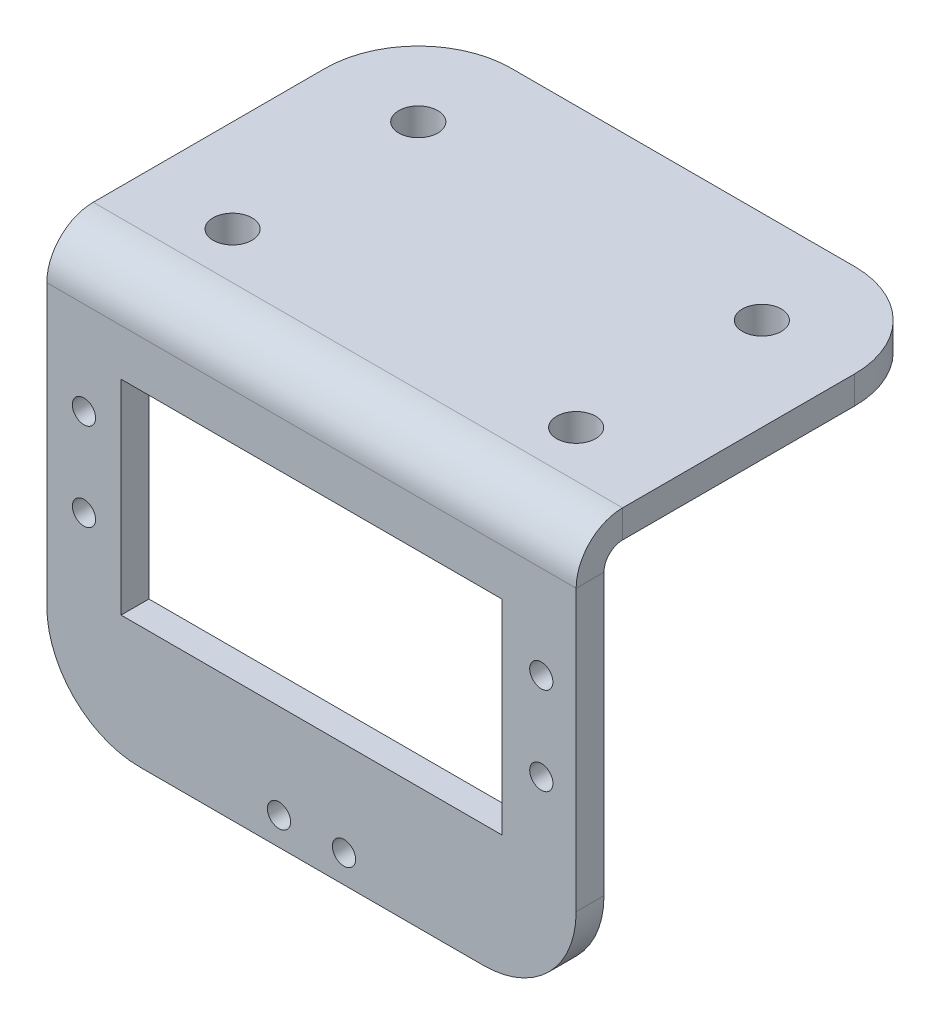
ISO-10303-21;
HEADER;
FILE_DESCRIPTION(('STEP AP214'),'2;1');
FILE_NAME('part.step','',(''),(''),'','','');
FILE_SCHEMA(('AUTOMOTIVE_DESIGN { 1 0 10303 214 1 1 1 1 }'));
ENDSEC;
DATA;
#1=APPLICATION_CONTEXT('core data for automotive mechanical design processes');
#2=APPLICATION_PROTOCOL_DEFINITION('international standard','automotive_design',2000,#1);
#3=PRODUCT_CONTEXT('',#1,'mechanical');
#4=PRODUCT('Part','Part','',(#3));
#5=PRODUCT_RELATED_PRODUCT_CATEGORY('part','',(#4));
#6=PRODUCT_DEFINITION_FORMATION('','',#4);
#7=PRODUCT_DEFINITION_CONTEXT('part definition',#1,'design');
#8=PRODUCT_DEFINITION('design','',#6,#7);
#9=PRODUCT_DEFINITION_SHAPE('','',#8);
#10=(LENGTH_UNIT() NAMED_UNIT(*) SI_UNIT(.MILLI.,.METRE.));
#11=(NAMED_UNIT(*) PLANE_ANGLE_UNIT() SI_UNIT($,.RADIAN.));
#12=(NAMED_UNIT(*) SI_UNIT($,.STERADIAN.) SOLID_ANGLE_UNIT());
#13=UNCERTAINTY_MEASURE_WITH_UNIT(LENGTH_MEASURE(1.E-05),#10,'distance_accuracy_value','');
#14=(GEOMETRIC_REPRESENTATION_CONTEXT(3) GLOBAL_UNCERTAINTY_ASSIGNED_CONTEXT((#13)) GLOBAL_UNIT_ASSIGNED_CONTEXT((#10,
#11,#12)) REPRESENTATION_CONTEXT('',''));
#15=CARTESIAN_POINT('',(0.,0.,0.));
#16=DIRECTION('',(0.,0.,1.));
#17=DIRECTION('',(1.,0.,0.));
#18=AXIS2_PLACEMENT_3D('',#15,#16,#17);
#19=CARTESIAN_POINT('',(57.,-1.58206781009085E-13,3.));
#20=DIRECTION('',(-1.,0.,0.));
#21=DIRECTION('',(0.,-1.,0.));
#22=AXIS2_PLACEMENT_3D('',#19,#20,#21);
#23=PLANE('',#22);
#24=DIRECTION('',(0.,-1.,0.));
#25=VECTOR('',#24,1.);
#26=CARTESIAN_POINT('',(57.,-1.58206781009085E-13,3.));
#27=LINE('',#26,#25);
#28=CARTESIAN_POINT('',(57.,5.00000000000001,3.));
#29=VERTEX_POINT('',#28);
#30=CARTESIAN_POINT('',(56.9999999999999,-25.1645936480419,3.));
#31=VERTEX_POINT('',#30);
#32=EDGE_CURVE('E412',#29,#31,#27,.T.);
#33=ORIENTED_EDGE('',*,*,#32,.T.);
#34=DIRECTION('',(0.,0.,1.));
#35=VECTOR('',#34,1.);
#36=CARTESIAN_POINT('',(56.9999999999999,-25.1645936480419,3.));
#37=LINE('',#36,#35);
#38=CARTESIAN_POINT('',(57.,-25.1645936480419,0.));
#39=VERTEX_POINT('',#38);
#40=EDGE_CURVE('E501',#31,#39,#37,.F.);
#41=ORIENTED_EDGE('',*,*,#40,.T.);
#42=DIRECTION('',(0.,1.,0.));
#43=VECTOR('',#42,1.);
#44=CARTESIAN_POINT('',(57.,0.,0.));
#45=LINE('',#44,#43);
#46=CARTESIAN_POINT('',(57.,5.00000000000001,0.));
#47=VERTEX_POINT('',#46);
#48=EDGE_CURVE('E451',#47,#39,#45,.F.);
#49=ORIENTED_EDGE('',*,*,#48,.F.);
#50=DIRECTION('',(0.,0.,1.));
#51=VECTOR('',#50,1.);
#52=CARTESIAN_POINT('',(57.,5.00000000000001,0.));
#53=LINE('',#52,#51);
#54=EDGE_CURVE('E396',#47,#29,#53,.T.);
#55=ORIENTED_EDGE('',*,*,#54,.T.);
#56=EDGE_LOOP('',(#33,#41,#49,#55));
#57=FACE_BOUND('',#56,.T.);
#58=ADVANCED_FACE('F237',(#57),#23,.F.);
#59=CARTESIAN_POINT('',(0.,0.,3.));
#60=DIRECTION('',(0.,0.,1.));
#61=DIRECTION('',(1.,0.,0.));
#62=AXIS2_PLACEMENT_3D('',#59,#60,#61);
#63=PLANE('',#62);
#64=DIRECTION('',(1.,0.,0.));
#65=VECTOR('',#64,1.);
#66=CARTESIAN_POINT('',(0.,0.,3.));
#67=LINE('',#66,#65);
#68=CARTESIAN_POINT('',(8.,0.,3.));
#69=VERTEX_POINT('',#68);
#70=CARTESIAN_POINT('',(49.,0.,3.));
#71=VERTEX_POINT('',#70);
#72=EDGE_CURVE('E418',#69,#71,#67,.T.);
#73=ORIENTED_EDGE('',*,*,#72,.T.);
#74=DIRECTION('',(0.,1.,0.));
#75=VECTOR('',#74,1.);
#76=CARTESIAN_POINT('',(49.0000000000002,-22.0000000000049,3.));
#77=LINE('',#76,#75);
#78=CARTESIAN_POINT('',(49.0000000000002,-22.0000000000049,3.));
#79=VERTEX_POINT('',#78);
#80=EDGE_CURVE('E421',#79,#71,#77,.T.);
#81=ORIENTED_EDGE('',*,*,#80,.F.);
#82=DIRECTION('',(1.,0.,0.));
#83=VECTOR('',#82,1.);
#84=CARTESIAN_POINT('',(8.00000000000015,-22.0000000000052,3.));
#85=LINE('',#84,#83);
#86=CARTESIAN_POINT('',(8.00000000000015,-22.0000000000052,3.));
#87=VERTEX_POINT('',#86);
#88=EDGE_CURVE('E424',#87,#79,#85,.T.);
#89=ORIENTED_EDGE('',*,*,#88,.F.);
#90=DIRECTION('',(0.,-1.,0.));
#91=VECTOR('',#90,1.);
#92=CARTESIAN_POINT('',(8.,0.,3.));
#93=LINE('',#92,#91);
#94=EDGE_CURVE('E427',#69,#87,#93,.T.);
#95=ORIENTED_EDGE('',*,*,#94,.F.);
#96=EDGE_LOOP('',(#73,#81,#89,#95));
#97=FACE_BOUND('',#96,.T.);
#98=CARTESIAN_POINT('',(32.,-32.1645936480419,3.));
#99=DIRECTION('',(0.,0.,1.));
#100=DIRECTION('',(1.,0.,0.));
#101=AXIS2_PLACEMENT_3D('',#98,#99,#100);
#102=CIRCLE('',#101,1.25);
#103=CARTESIAN_POINT('',(33.25,-32.1645936480419,3.));
#104=VERTEX_POINT('',#103);
#105=EDGE_CURVE('E430',#104,#104,#102,.T.);
#106=ORIENTED_EDGE('',*,*,#105,.F.);
#107=EDGE_LOOP('',(#106));
#108=FACE_BOUND('',#107,.T.);
#109=CARTESIAN_POINT('',(53.2500000000001,-14.4545936480419,3.));
#110=DIRECTION('',(0.,0.,1.));
#111=DIRECTION('',(1.,0.,0.));
#112=AXIS2_PLACEMENT_3D('',#109,#110,#111);
#113=CIRCLE('',#112,1.25000000000001);
#114=CARTESIAN_POINT('',(54.5000000000001,-14.4545936480419,3.));
#115=VERTEX_POINT('',#114);
#116=EDGE_CURVE('E433',#115,#115,#113,.T.);
#117=ORIENTED_EDGE('',*,*,#116,.F.);
#118=EDGE_LOOP('',(#117));
#119=FACE_BOUND('',#118,.T.);
#120=CARTESIAN_POINT('',(4.00000000000004,-4.99999999999997,3.));
#121=DIRECTION('',(0.,0.,1.));
#122=DIRECTION('',(1.,0.,0.));
#123=AXIS2_PLACEMENT_3D('',#120,#121,#122);
#124=CIRCLE('',#123,1.25000000000004);
#125=CARTESIAN_POINT('',(5.25000000000008,-4.99999999999997,3.));
#126=VERTEX_POINT('',#125);
#127=EDGE_CURVE('E436',#126,#126,#124,.T.);
#128=ORIENTED_EDGE('',*,*,#127,.F.);
#129=EDGE_LOOP('',(#128));
#130=FACE_BOUND('',#129,.T.);
#131=CARTESIAN_POINT('',(4.0000000000001,-14.4545936480419,3.));
#132=DIRECTION('',(0.,0.,1.));
#133=DIRECTION('',(1.,0.,0.));
#134=AXIS2_PLACEMENT_3D('',#131,#132,#133);
#135=CIRCLE('',#134,1.25);
#136=CARTESIAN_POINT('',(5.2500000000001,-14.4545936480419,3.));
#137=VERTEX_POINT('',#136);
#138=EDGE_CURVE('E439',#137,#137,#135,.T.);
#139=ORIENTED_EDGE('',*,*,#138,.F.);
#140=EDGE_LOOP('',(#139));
#141=FACE_BOUND('',#140,.T.);
#142=CARTESIAN_POINT('',(25.,-32.1645936480419,3.));
#143=DIRECTION('',(0.,0.,1.));
#144=DIRECTION('',(1.,0.,0.));
#145=AXIS2_PLACEMENT_3D('',#142,#143,#144);
#146=CIRCLE('',#145,1.24999999999924);
#147=CARTESIAN_POINT('',(26.2499999999992,-32.1645936480419,3.));
#148=VERTEX_POINT('',#147);
#149=EDGE_CURVE('E442',#148,#148,#146,.T.);
#150=ORIENTED_EDGE('',*,*,#149,.F.);
#151=EDGE_LOOP('',(#150));
#152=FACE_BOUND('',#151,.T.);
#153=CARTESIAN_POINT('',(53.25,-4.99999999999963,3.));
#154=DIRECTION('',(0.,0.,1.));
#155=DIRECTION('',(1.,0.,0.));
#156=AXIS2_PLACEMENT_3D('',#153,#154,#155);
#157=CIRCLE('',#156,1.25);
#158=CARTESIAN_POINT('',(54.5,-4.99999999999963,3.));
#159=VERTEX_POINT('',#158);
#160=EDGE_CURVE('E445',#159,#159,#157,.T.);
#161=ORIENTED_EDGE('',*,*,#160,.F.);
#162=EDGE_LOOP('',(#161));
#163=FACE_BOUND('',#162,.T.);
#164=DIRECTION('',(1.,0.,0.));
#165=VECTOR('',#164,1.);
#166=CARTESIAN_POINT('',(8.,-35.1645936480419,3.));
#167=LINE('',#166,#165);
#168=CARTESIAN_POINT('',(10.,-35.1645936480419,3.));
#169=VERTEX_POINT('',#168);
#170=CARTESIAN_POINT('',(46.9999999999999,-35.1645936480419,3.));
#171=VERTEX_POINT('',#170);
#172=EDGE_CURVE('E409',#169,#171,#167,.T.);
#173=ORIENTED_EDGE('',*,*,#172,.T.);
#174=CARTESIAN_POINT('',(46.9999999999999,-25.1645936480419,3.));
#175=DIRECTION('',(0.,0.,1.));
#176=DIRECTION('',(1.,0.,0.));
#177=AXIS2_PLACEMENT_3D('',#174,#175,#176);
#178=CIRCLE('',#177,10.);
#179=EDGE_CURVE('E499',#171,#31,#178,.T.);
#180=ORIENTED_EDGE('',*,*,#179,.T.);
#181=ORIENTED_EDGE('',*,*,#32,.F.);
#182=DIRECTION('',(1.,0.,0.));
#183=VECTOR('',#182,1.);
#184=CARTESIAN_POINT('',(57.,5.00000000000001,3.));
#185=LINE('',#184,#183);
#186=CARTESIAN_POINT('',(0.,5.00000000000001,3.));
#187=VERTEX_POINT('',#186);
#188=EDGE_CURVE('E369',#29,#187,#185,.F.);
#189=ORIENTED_EDGE('',*,*,#188,.T.);
#190=DIRECTION('',(0.,1.,0.));
#191=VECTOR('',#190,1.);
#192=CARTESIAN_POINT('',(0.,0.,3.));
#193=LINE('',#192,#191);
#194=CARTESIAN_POINT('',(0.,-25.1645936480419,3.));
#195=VERTEX_POINT('',#194);
#196=EDGE_CURVE('E416',#195,#187,#193,.T.);
#197=ORIENTED_EDGE('',*,*,#196,.F.);
#198=CARTESIAN_POINT('',(10.,-25.1645936480419,3.));
#199=DIRECTION('',(0.,0.,1.));
#200=DIRECTION('',(1.,0.,0.));
#201=AXIS2_PLACEMENT_3D('',#198,#199,#200);
#202=CIRCLE('',#201,10.);
#203=EDGE_CURVE('E497',#195,#169,#202,.T.);
#204=ORIENTED_EDGE('',*,*,#203,.T.);
#205=EDGE_LOOP('',(#173,#180,#181,#189,#197,#204));
#206=FACE_BOUND('',#205,.T.);
#207=ADVANCED_FACE('F584',(#97,#108,#119,#130,#141,#152,#163,#206),#63,.T.);
#208=CARTESIAN_POINT('',(0.,0.,0.));
#209=DIRECTION('',(0.,0.,1.));
#210=DIRECTION('',(1.,0.,0.));
#211=AXIS2_PLACEMENT_3D('',#208,#209,#210);
#212=PLANE('',#211);
#213=CARTESIAN_POINT('',(53.25,-4.99999999999963,0.));
#214=DIRECTION('',(0.,0.,1.));
#215=DIRECTION('',(1.,0.,0.));
#216=AXIS2_PLACEMENT_3D('',#213,#214,#215);
#217=CIRCLE('',#216,1.25);
#218=CARTESIAN_POINT('',(54.5,-4.99999999999963,0.));
#219=VERTEX_POINT('',#218);
#220=EDGE_CURVE('E413',#219,#219,#217,.T.);
#221=ORIENTED_EDGE('',*,*,#220,.T.);
#222=EDGE_LOOP('',(#221));
#223=FACE_BOUND('',#222,.T.);
#224=CARTESIAN_POINT('',(25.,-32.1645936480419,0.));
#225=DIRECTION('',(0.,0.,1.));
#226=DIRECTION('',(1.,0.,0.));
#227=AXIS2_PLACEMENT_3D('',#224,#225,#226);
#228=CIRCLE('',#227,1.24999999999924);
#229=CARTESIAN_POINT('',(26.2499999999992,-32.1645936480419,0.));
#230=VERTEX_POINT('',#229);
#231=EDGE_CURVE('E480',#230,#230,#228,.T.);
#232=ORIENTED_EDGE('',*,*,#231,.T.);
#233=EDGE_LOOP('',(#232));
#234=FACE_BOUND('',#233,.T.);
#235=CARTESIAN_POINT('',(4.0000000000001,-14.4545936480419,0.));
#236=DIRECTION('',(0.,0.,1.));
#237=DIRECTION('',(1.,0.,0.));
#238=AXIS2_PLACEMENT_3D('',#235,#236,#237);
#239=CIRCLE('',#238,1.25);
#240=CARTESIAN_POINT('',(5.2500000000001,-14.4545936480419,0.));
#241=VERTEX_POINT('',#240);
#242=EDGE_CURVE('E477',#241,#241,#239,.T.);
#243=ORIENTED_EDGE('',*,*,#242,.T.);
#244=EDGE_LOOP('',(#243));
#245=FACE_BOUND('',#244,.T.);
#246=CARTESIAN_POINT('',(4.00000000000004,-4.99999999999997,0.));
#247=DIRECTION('',(0.,0.,1.));
#248=DIRECTION('',(1.,0.,0.));
#249=AXIS2_PLACEMENT_3D('',#246,#247,#248);
#250=CIRCLE('',#249,1.25000000000004);
#251=CARTESIAN_POINT('',(5.25000000000008,-4.99999999999997,0.));
#252=VERTEX_POINT('',#251);
#253=EDGE_CURVE('E474',#252,#252,#250,.T.);
#254=ORIENTED_EDGE('',*,*,#253,.T.);
#255=EDGE_LOOP('',(#254));
#256=FACE_BOUND('',#255,.T.);
#257=CARTESIAN_POINT('',(53.2500000000001,-14.4545936480419,0.));
#258=DIRECTION('',(0.,0.,1.));
#259=DIRECTION('',(1.,0.,0.));
#260=AXIS2_PLACEMENT_3D('',#257,#258,#259);
#261=CIRCLE('',#260,1.25000000000001);
#262=CARTESIAN_POINT('',(54.5000000000001,-14.4545936480419,0.));
#263=VERTEX_POINT('',#262);
#264=EDGE_CURVE('E471',#263,#263,#261,.T.);
#265=ORIENTED_EDGE('',*,*,#264,.T.);
#266=EDGE_LOOP('',(#265));
#267=FACE_BOUND('',#266,.T.);
#268=CARTESIAN_POINT('',(32.,-32.1645936480419,0.));
#269=DIRECTION('',(0.,0.,1.));
#270=DIRECTION('',(1.,0.,0.));
#271=AXIS2_PLACEMENT_3D('',#268,#269,#270);
#272=CIRCLE('',#271,1.25);
#273=CARTESIAN_POINT('',(33.25,-32.1645936480419,0.));
#274=VERTEX_POINT('',#273);
#275=EDGE_CURVE('E463',#274,#274,#272,.T.);
#276=ORIENTED_EDGE('',*,*,#275,.T.);
#277=EDGE_LOOP('',(#276));
#278=FACE_BOUND('',#277,.T.);
#279=DIRECTION('',(1.,0.,0.));
#280=VECTOR('',#279,1.);
#281=CARTESIAN_POINT('',(0.,0.,0.));
#282=LINE('',#281,#280);
#283=CARTESIAN_POINT('',(8.,0.,0.));
#284=VERTEX_POINT('',#283);
#285=CARTESIAN_POINT('',(49.,0.,0.));
#286=VERTEX_POINT('',#285);
#287=EDGE_CURVE('E454',#284,#286,#282,.T.);
#288=ORIENTED_EDGE('',*,*,#287,.F.);
#289=DIRECTION('',(0.,1.,0.));
#290=VECTOR('',#289,1.);
#291=CARTESIAN_POINT('',(8.,0.,0.));
#292=LINE('',#291,#290);
#293=CARTESIAN_POINT('',(8.00000000000015,-22.0000000000052,0.));
#294=VERTEX_POINT('',#293);
#295=EDGE_CURVE('E460',#284,#294,#292,.F.);
#296=ORIENTED_EDGE('',*,*,#295,.T.);
#297=DIRECTION('',(1.,0.,0.));
#298=VECTOR('',#297,1.);
#299=CARTESIAN_POINT('',(0.,-22.0000000000052,0.));
#300=LINE('',#299,#298);
#301=CARTESIAN_POINT('',(49.0000000000002,-22.0000000000049,0.));
#302=VERTEX_POINT('',#301);
#303=EDGE_CURVE('E464',#294,#302,#300,.T.);
#304=ORIENTED_EDGE('',*,*,#303,.T.);
#305=DIRECTION('',(0.,1.,0.));
#306=VECTOR('',#305,1.);
#307=CARTESIAN_POINT('',(49.0000000000002,0.,0.));
#308=LINE('',#307,#306);
#309=EDGE_CURVE('E459',#302,#286,#308,.T.);
#310=ORIENTED_EDGE('',*,*,#309,.T.);
#311=EDGE_LOOP('',(#288,#296,#304,#310));
#312=FACE_BOUND('',#311,.T.);
#313=ORIENTED_EDGE('',*,*,#48,.T.);
#314=CARTESIAN_POINT('',(46.9999999999999,-25.1645936480419,0.));
#315=DIRECTION('',(0.,0.,1.));
#316=DIRECTION('',(1.,0.,0.));
#317=AXIS2_PLACEMENT_3D('',#314,#315,#316);
#318=CIRCLE('',#317,10.);
#319=CARTESIAN_POINT('',(46.9999999999999,-35.1645936480419,0.));
#320=VERTEX_POINT('',#319);
#321=EDGE_CURVE('E505',#39,#320,#318,.F.);
#322=ORIENTED_EDGE('',*,*,#321,.T.);
#323=DIRECTION('',(1.,0.,0.));
#324=VECTOR('',#323,1.);
#325=CARTESIAN_POINT('',(0.,-35.1645936480419,0.));
#326=LINE('',#325,#324);
#327=CARTESIAN_POINT('',(10.,-35.1645936480419,0.));
#328=VERTEX_POINT('',#327);
#329=EDGE_CURVE('E407',#328,#320,#326,.T.);
#330=ORIENTED_EDGE('',*,*,#329,.F.);
#331=CARTESIAN_POINT('',(10.,-25.1645936480419,0.));
#332=DIRECTION('',(0.,0.,1.));
#333=DIRECTION('',(1.,0.,0.));
#334=AXIS2_PLACEMENT_3D('',#331,#332,#333);
#335=CIRCLE('',#334,10.);
#336=CARTESIAN_POINT('',(0.,-25.1645936480419,0.));
#337=VERTEX_POINT('',#336);
#338=EDGE_CURVE('E503',#328,#337,#335,.F.);
#339=ORIENTED_EDGE('',*,*,#338,.T.);
#340=DIRECTION('',(0.,1.,0.));
#341=VECTOR('',#340,1.);
#342=CARTESIAN_POINT('',(0.,0.,0.));
#343=LINE('',#342,#341);
#344=CARTESIAN_POINT('',(0.,5.00000000000001,0.));
#345=VERTEX_POINT('',#344);
#346=EDGE_CURVE('E452',#337,#345,#343,.T.);
#347=ORIENTED_EDGE('',*,*,#346,.T.);
#348=DIRECTION('',(1.,0.,0.));
#349=VECTOR('',#348,1.);
#350=CARTESIAN_POINT('',(57.,5.00000000000001,0.));
#351=LINE('',#350,#349);
#352=EDGE_CURVE('E400',#47,#345,#351,.F.);
#353=ORIENTED_EDGE('',*,*,#352,.F.);
#354=EDGE_LOOP('',(#313,#322,#330,#339,#347,#353));
#355=FACE_BOUND('',#354,.T.);
#356=ADVANCED_FACE('F590',(#223,#234,#245,#256,#267,#278,#312,#355),#212,.F.);
#357=CARTESIAN_POINT('',(8.00000000000015,-22.0000000000052,3.));
#358=DIRECTION('',(0.,-1.,0.));
#359=DIRECTION('',(1.,0.,0.));
#360=AXIS2_PLACEMENT_3D('',#357,#358,#359);
#361=PLANE('',#360);
#362=DIRECTION('',(0.,0.,1.));
#363=VECTOR('',#362,1.);
#364=CARTESIAN_POINT('',(49.0000000000002,-22.0000000000049,3.));
#365=LINE('',#364,#363);
#366=EDGE_CURVE('E489',#302,#79,#365,.T.);
#367=ORIENTED_EDGE('',*,*,#366,.F.);
#368=ORIENTED_EDGE('',*,*,#303,.F.);
#369=DIRECTION('',(0.,0.,1.));
#370=VECTOR('',#369,1.);
#371=CARTESIAN_POINT('',(8.00000000000015,-22.0000000000052,3.));
#372=LINE('',#371,#370);
#373=EDGE_CURVE('E487',#294,#87,#372,.T.);
#374=ORIENTED_EDGE('',*,*,#373,.T.);
#375=ORIENTED_EDGE('',*,*,#88,.T.);
#376=EDGE_LOOP('',(#367,#368,#374,#375));
#377=FACE_BOUND('',#376,.T.);
#378=ADVANCED_FACE('F604',(#377),#361,.F.);
#379=CARTESIAN_POINT('',(8.,0.,3.));
#380=DIRECTION('',(-1.,0.,0.));
#381=DIRECTION('',(0.,-1.,0.));
#382=AXIS2_PLACEMENT_3D('',#379,#380,#381);
#383=PLANE('',#382);
#384=ORIENTED_EDGE('',*,*,#373,.F.);
#385=ORIENTED_EDGE('',*,*,#295,.F.);
#386=DIRECTION('',(0.,0.,1.));
#387=VECTOR('',#386,1.);
#388=CARTESIAN_POINT('',(8.,0.,3.));
#389=LINE('',#388,#387);
#390=EDGE_CURVE('E485',#284,#69,#389,.T.);
#391=ORIENTED_EDGE('',*,*,#390,.T.);
#392=ORIENTED_EDGE('',*,*,#94,.T.);
#393=EDGE_LOOP('',(#384,#385,#391,#392));
#394=FACE_BOUND('',#393,.T.);
#395=ADVANCED_FACE('F600',(#394),#383,.F.);
#396=CARTESIAN_POINT('',(0.,0.,3.));
#397=DIRECTION('',(0.,-1.,0.));
#398=DIRECTION('',(1.,0.,0.));
#399=AXIS2_PLACEMENT_3D('',#396,#397,#398);
#400=PLANE('',#399);
#401=ORIENTED_EDGE('',*,*,#390,.F.);
#402=ORIENTED_EDGE('',*,*,#287,.T.);
#403=DIRECTION('',(0.,0.,1.));
#404=VECTOR('',#403,1.);
#405=CARTESIAN_POINT('',(49.,0.,3.));
#406=LINE('',#405,#404);
#407=EDGE_CURVE('E448',#286,#71,#406,.T.);
#408=ORIENTED_EDGE('',*,*,#407,.T.);
#409=ORIENTED_EDGE('',*,*,#72,.F.);
#410=EDGE_LOOP('',(#401,#402,#408,#409));
#411=FACE_BOUND('',#410,.T.);
#412=ADVANCED_FACE('F597',(#411),#400,.T.);
#413=CARTESIAN_POINT('',(0.,0.,3.));
#414=DIRECTION('',(1.,0.,0.));
#415=DIRECTION('',(0.,1.,0.));
#416=AXIS2_PLACEMENT_3D('',#413,#414,#415);
#417=PLANE('',#416);
#418=ORIENTED_EDGE('',*,*,#346,.F.);
#419=DIRECTION('',(0.,0.,1.));
#420=VECTOR('',#419,1.);
#421=CARTESIAN_POINT('',(0.,-25.1645936480419,3.));
#422=LINE('',#421,#420);
#423=EDGE_CURVE('E507',#337,#195,#422,.T.);
#424=ORIENTED_EDGE('',*,*,#423,.T.);
#425=ORIENTED_EDGE('',*,*,#196,.T.);
#426=DIRECTION('',(0.,0.,1.));
#427=VECTOR('',#426,1.);
#428=CARTESIAN_POINT('',(0.,5.00000000000001,0.));
#429=LINE('',#428,#427);
#430=EDGE_CURVE('E404',#345,#187,#429,.T.);
#431=ORIENTED_EDGE('',*,*,#430,.F.);
#432=EDGE_LOOP('',(#418,#424,#425,#431));
#433=FACE_BOUND('',#432,.T.);
#434=ADVANCED_FACE('F595',(#433),#417,.F.);
#435=CARTESIAN_POINT('',(8.,-35.1645936480419,3.));
#436=DIRECTION('',(0.,-1.,0.));
#437=DIRECTION('',(1.,0.,0.));
#438=AXIS2_PLACEMENT_3D('',#435,#436,#437);
#439=PLANE('',#438);
#440=ORIENTED_EDGE('',*,*,#329,.T.);
#441=DIRECTION('',(0.,0.,-1.));
#442=VECTOR('',#441,1.);
#443=CARTESIAN_POINT('',(46.9999999999999,-35.1645936480419,3.));
#444=LINE('',#443,#442);
#445=EDGE_CURVE('E494',#320,#171,#444,.F.);
#446=ORIENTED_EDGE('',*,*,#445,.T.);
#447=ORIENTED_EDGE('',*,*,#172,.F.);
#448=DIRECTION('',(0.,0.,-1.));
#449=VECTOR('',#448,1.);
#450=CARTESIAN_POINT('',(10.,-35.1645936480419,3.));
#451=LINE('',#450,#449);
#452=EDGE_CURVE('E491',#169,#328,#451,.T.);
#453=ORIENTED_EDGE('',*,*,#452,.T.);
#454=EDGE_LOOP('',(#440,#446,#447,#453));
#455=FACE_BOUND('',#454,.T.);
#456=ADVANCED_FACE('F613',(#455),#439,.T.);
#457=CARTESIAN_POINT('',(49.0000000000002,-22.0000000000049,3.));
#458=DIRECTION('',(1.,0.,0.));
#459=DIRECTION('',(0.,1.,0.));
#460=AXIS2_PLACEMENT_3D('',#457,#458,#459);
#461=PLANE('',#460);
#462=ORIENTED_EDGE('',*,*,#309,.F.);
#463=ORIENTED_EDGE('',*,*,#366,.T.);
#464=ORIENTED_EDGE('',*,*,#80,.T.);
#465=ORIENTED_EDGE('',*,*,#407,.F.);
#466=EDGE_LOOP('',(#462,#463,#464,#465));
#467=FACE_BOUND('',#466,.T.);
#468=ADVANCED_FACE('F609',(#467),#461,.F.);
#469=CARTESIAN_POINT('',(32.,-32.1645936480419,3.));
#470=DIRECTION('',(0.,0.,1.));
#471=DIRECTION('',(1.,0.,0.));
#472=AXIS2_PLACEMENT_3D('',#469,#470,#471);
#473=CYLINDRICAL_SURFACE('',#472,1.25);
#474=ORIENTED_EDGE('',*,*,#105,.T.);
#475=EDGE_LOOP('',(#474));
#476=FACE_BOUND('',#475,.T.);
#477=ORIENTED_EDGE('',*,*,#275,.F.);
#478=EDGE_LOOP('',(#477));
#479=FACE_BOUND('',#478,.T.);
#480=ADVANCED_FACE('F612',(#476,#479),#473,.F.);
#481=CARTESIAN_POINT('',(53.2500000000001,-14.4545936480419,3.));
#482=DIRECTION('',(0.,0.,1.));
#483=DIRECTION('',(1.,0.,0.));
#484=AXIS2_PLACEMENT_3D('',#481,#482,#483);
#485=CYLINDRICAL_SURFACE('',#484,1.25000000000001);
#486=ORIENTED_EDGE('',*,*,#116,.T.);
#487=EDGE_LOOP('',(#486));
#488=FACE_BOUND('',#487,.T.);
#489=ORIENTED_EDGE('',*,*,#264,.F.);
#490=EDGE_LOOP('',(#489));
#491=FACE_BOUND('',#490,.T.);
#492=ADVANCED_FACE('F617',(#488,#491),#485,.F.);
#493=CARTESIAN_POINT('',(4.00000000000004,-4.99999999999997,3.));
#494=DIRECTION('',(0.,0.,1.));
#495=DIRECTION('',(1.,0.,0.));
#496=AXIS2_PLACEMENT_3D('',#493,#494,#495);
#497=CYLINDRICAL_SURFACE('',#496,1.25000000000004);
#498=ORIENTED_EDGE('',*,*,#127,.T.);
#499=EDGE_LOOP('',(#498));
#500=FACE_BOUND('',#499,.T.);
#501=ORIENTED_EDGE('',*,*,#253,.F.);
#502=EDGE_LOOP('',(#501));
#503=FACE_BOUND('',#502,.T.);
#504=ADVANCED_FACE('F621',(#500,#503),#497,.F.);
#505=CARTESIAN_POINT('',(4.0000000000001,-14.4545936480419,3.));
#506=DIRECTION('',(0.,0.,1.));
#507=DIRECTION('',(1.,0.,0.));
#508=AXIS2_PLACEMENT_3D('',#505,#506,#507);
#509=CYLINDRICAL_SURFACE('',#508,1.25);
#510=ORIENTED_EDGE('',*,*,#138,.T.);
#511=EDGE_LOOP('',(#510));
#512=FACE_BOUND('',#511,.T.);
#513=ORIENTED_EDGE('',*,*,#242,.F.);
#514=EDGE_LOOP('',(#513));
#515=FACE_BOUND('',#514,.T.);
#516=ADVANCED_FACE('F625',(#512,#515),#509,.F.);
#517=CARTESIAN_POINT('',(25.,-32.1645936480419,3.));
#518=DIRECTION('',(0.,0.,1.));
#519=DIRECTION('',(1.,0.,0.));
#520=AXIS2_PLACEMENT_3D('',#517,#518,#519);
#521=CYLINDRICAL_SURFACE('',#520,1.24999999999924);
#522=ORIENTED_EDGE('',*,*,#149,.T.);
#523=EDGE_LOOP('',(#522));
#524=FACE_BOUND('',#523,.T.);
#525=ORIENTED_EDGE('',*,*,#231,.F.);
#526=EDGE_LOOP('',(#525));
#527=FACE_BOUND('',#526,.T.);
#528=ADVANCED_FACE('F629',(#524,#527),#521,.F.);
#529=CARTESIAN_POINT('',(53.25,-4.99999999999963,3.));
#530=DIRECTION('',(0.,0.,1.));
#531=DIRECTION('',(1.,0.,0.));
#532=AXIS2_PLACEMENT_3D('',#529,#530,#531);
#533=CYLINDRICAL_SURFACE('',#532,1.25);
#534=ORIENTED_EDGE('',*,*,#160,.T.);
#535=EDGE_LOOP('',(#534));
#536=FACE_BOUND('',#535,.T.);
#537=ORIENTED_EDGE('',*,*,#220,.F.);
#538=EDGE_LOOP('',(#537));
#539=FACE_BOUND('',#538,.T.);
#540=ADVANCED_FACE('F633',(#536,#539),#533,.F.);
#541=CARTESIAN_POINT('',(0.,5.00000000000001,-2.));
#542=DIRECTION('',(-1.,0.,0.));
#543=DIRECTION('',(0.,0.,1.));
#544=AXIS2_PLACEMENT_3D('',#541,#542,#543);
#545=PLANE('',#544);
#546=DIRECTION('',(0.,1.,0.));
#547=VECTOR('',#546,1.);
#548=CARTESIAN_POINT('',(0.,10.,-1.99999999999999));
#549=LINE('',#548,#547);
#550=CARTESIAN_POINT('',(0.,7.00000000000001,-1.99999999999999));
#551=VERTEX_POINT('',#550);
#552=CARTESIAN_POINT('',(0.,10.,-1.99999999999998));
#553=VERTEX_POINT('',#552);
#554=EDGE_CURVE('E390',#551,#553,#549,.T.);
#555=ORIENTED_EDGE('',*,*,#554,.F.);
#556=CARTESIAN_POINT('',(0.,5.00000000000001,-2.));
#557=DIRECTION('',(1.,0.,0.));
#558=DIRECTION('',(0.,0.,-1.));
#559=AXIS2_PLACEMENT_3D('',#556,#557,#558);
#560=CIRCLE('',#559,2.);
#561=EDGE_CURVE('E372',#345,#551,#560,.F.);
#562=ORIENTED_EDGE('',*,*,#561,.F.);
#563=ORIENTED_EDGE('',*,*,#430,.T.);
#564=CARTESIAN_POINT('',(0.,5.00000000000001,-2.));
#565=DIRECTION('',(1.,0.,0.));
#566=DIRECTION('',(0.,0.,-1.));
#567=AXIS2_PLACEMENT_3D('',#564,#565,#566);
#568=CIRCLE('',#567,5.);
#569=EDGE_CURVE('E395',#187,#553,#568,.F.);
#570=ORIENTED_EDGE('',*,*,#569,.T.);
#571=EDGE_LOOP('',(#555,#562,#563,#570));
#572=FACE_BOUND('',#571,.T.);
#573=ADVANCED_FACE('F637',(#572),#545,.T.);
#574=CARTESIAN_POINT('',(57.,5.00000000000001,-2.));
#575=DIRECTION('',(-1.,0.,0.));
#576=DIRECTION('',(0.,0.,1.));
#577=AXIS2_PLACEMENT_3D('',#574,#575,#576);
#578=PLANE('',#577);
#579=CARTESIAN_POINT('',(57.,5.00000000000001,-2.));
#580=DIRECTION('',(1.,0.,0.));
#581=DIRECTION('',(0.,0.,-1.));
#582=AXIS2_PLACEMENT_3D('',#579,#580,#581);
#583=CIRCLE('',#582,2.);
#584=CARTESIAN_POINT('',(57.,7.00000000000001,-1.99999999999999));
#585=VERTEX_POINT('',#584);
#586=EDGE_CURVE('E358',#585,#47,#583,.T.);
#587=ORIENTED_EDGE('',*,*,#586,.F.);
#588=DIRECTION('',(0.,1.,0.));
#589=VECTOR('',#588,1.);
#590=CARTESIAN_POINT('',(57.,7.00000000000001,-1.99999999999999));
#591=LINE('',#590,#589);
#592=CARTESIAN_POINT('',(57.,10.,-1.99999999999998));
#593=VERTEX_POINT('',#592);
#594=EDGE_CURVE('E355',#585,#593,#591,.T.);
#595=ORIENTED_EDGE('',*,*,#594,.T.);
#596=CARTESIAN_POINT('',(57.,5.00000000000001,-2.));
#597=DIRECTION('',(1.,0.,0.));
#598=DIRECTION('',(0.,0.,-1.));
#599=AXIS2_PLACEMENT_3D('',#596,#597,#598);
#600=CIRCLE('',#599,5.);
#601=EDGE_CURVE('E363',#593,#29,#600,.T.);
#602=ORIENTED_EDGE('',*,*,#601,.T.);
#603=ORIENTED_EDGE('',*,*,#54,.F.);
#604=EDGE_LOOP('',(#587,#595,#602,#603));
#605=FACE_BOUND('',#604,.T.);
#606=ADVANCED_FACE('F375',(#605),#578,.F.);
#607=CARTESIAN_POINT('',(57.,5.00000000000001,-2.));
#608=DIRECTION('',(1.,0.,0.));
#609=DIRECTION('',(0.,1.,0.));
#610=AXIS2_PLACEMENT_3D('',#607,#608,#609);
#611=CYLINDRICAL_SURFACE('',#610,5.);
#612=ORIENTED_EDGE('',*,*,#188,.F.);
#613=ORIENTED_EDGE('',*,*,#601,.F.);
#614=DIRECTION('',(1.,0.,0.));
#615=VECTOR('',#614,1.);
#616=CARTESIAN_POINT('',(0.,10.,-1.99999999999998));
#617=LINE('',#616,#615);
#618=EDGE_CURVE('E366',#553,#593,#617,.T.);
#619=ORIENTED_EDGE('',*,*,#618,.F.);
#620=ORIENTED_EDGE('',*,*,#569,.F.);
#621=EDGE_LOOP('',(#612,#613,#619,#620));
#622=FACE_BOUND('',#621,.T.);
#623=ADVANCED_FACE('F364',(#622),#611,.T.);
#624=CARTESIAN_POINT('',(57.,5.00000000000001,-2.));
#625=DIRECTION('',(1.,0.,0.));
#626=DIRECTION('',(0.,1.,0.));
#627=AXIS2_PLACEMENT_3D('',#624,#625,#626);
#628=CYLINDRICAL_SURFACE('',#627,2.);
#629=ORIENTED_EDGE('',*,*,#352,.T.);
#630=ORIENTED_EDGE('',*,*,#561,.T.);
#631=DIRECTION('',(-1.,0.,0.));
#632=VECTOR('',#631,1.);
#633=CARTESIAN_POINT('',(0.,7.00000000000001,-1.99999999999999));
#634=LINE('',#633,#632);
#635=EDGE_CURVE('E377',#551,#585,#634,.F.);
#636=ORIENTED_EDGE('',*,*,#635,.T.);
#637=ORIENTED_EDGE('',*,*,#586,.T.);
#638=EDGE_LOOP('',(#629,#630,#636,#637));
#639=FACE_BOUND('',#638,.T.);
#640=ADVANCED_FACE('F659',(#639),#628,.F.);
#641=CARTESIAN_POINT('',(57.,10.,0.));
#642=DIRECTION('',(1.,0.,0.));
#643=DIRECTION('',(0.,0.,-1.));
#644=AXIS2_PLACEMENT_3D('',#641,#642,#643);
#645=PLANE('',#644);
#646=DIRECTION('',(0.,0.,-1.));
#647=VECTOR('',#646,1.);
#648=CARTESIAN_POINT('',(57.,7.,0.));
#649=LINE('',#648,#647);
#650=CARTESIAN_POINT('',(57.,7.00000000000009,-27.));
#651=VERTEX_POINT('',#650);
#652=EDGE_CURVE('E533',#651,#585,#649,.F.);
#653=ORIENTED_EDGE('',*,*,#652,.F.);
#654=DIRECTION('',(0.,-1.,0.));
#655=VECTOR('',#654,1.);
#656=CARTESIAN_POINT('',(57.,10.0000000000001,-27.));
#657=LINE('',#656,#655);
#658=CARTESIAN_POINT('',(57.,10.0000000000001,-27.));
#659=VERTEX_POINT('',#658);
#660=EDGE_CURVE('E260',#651,#659,#657,.F.);
#661=ORIENTED_EDGE('',*,*,#660,.T.);
#662=DIRECTION('',(0.,0.,1.));
#663=VECTOR('',#662,1.);
#664=CARTESIAN_POINT('',(57.,10.,0.));
#665=LINE('',#664,#663);
#666=EDGE_CURVE('E351',#659,#593,#665,.T.);
#667=ORIENTED_EDGE('',*,*,#666,.T.);
#668=ORIENTED_EDGE('',*,*,#594,.F.);
#669=EDGE_LOOP('',(#653,#661,#667,#668));
#670=FACE_BOUND('',#669,.T.);
#671=ADVANCED_FACE('F353',(#670),#645,.T.);
#672=CARTESIAN_POINT('',(0.,10.0000000000001,-37.));
#673=DIRECTION('',(-1.,0.,0.));
#674=DIRECTION('',(0.,0.,1.));
#675=AXIS2_PLACEMENT_3D('',#672,#673,#674);
#676=PLANE('',#675);
#677=DIRECTION('',(0.,0.,-1.));
#678=VECTOR('',#677,1.);
#679=CARTESIAN_POINT('',(0.,10.0000000000001,-37.));
#680=LINE('',#679,#678);
#681=CARTESIAN_POINT('',(0.,10.0000000000001,-27.));
#682=VERTEX_POINT('',#681);
#683=EDGE_CURVE('E380',#553,#682,#680,.T.);
#684=ORIENTED_EDGE('',*,*,#683,.T.);
#685=DIRECTION('',(0.,-1.,0.));
#686=VECTOR('',#685,1.);
#687=CARTESIAN_POINT('',(0.,10.0000000000001,-27.));
#688=LINE('',#687,#686);
#689=CARTESIAN_POINT('',(0.,7.00000000000009,-27.));
#690=VERTEX_POINT('',#689);
#691=EDGE_CURVE('E13',#682,#690,#688,.T.);
#692=ORIENTED_EDGE('',*,*,#691,.T.);
#693=DIRECTION('',(0.,0.,1.));
#694=VECTOR('',#693,1.);
#695=CARTESIAN_POINT('',(0.,7.,0.));
#696=LINE('',#695,#694);
#697=EDGE_CURVE('E381',#551,#690,#696,.F.);
#698=ORIENTED_EDGE('',*,*,#697,.F.);
#699=ORIENTED_EDGE('',*,*,#554,.T.);
#700=EDGE_LOOP('',(#684,#692,#698,#699));
#701=FACE_BOUND('',#700,.T.);
#702=ADVANCED_FACE('F657',(#701),#676,.T.);
#703=CARTESIAN_POINT('',(0.,10.,0.));
#704=DIRECTION('',(0.,1.,0.));
#705=DIRECTION('',(0.,0.,1.));
#706=AXIS2_PLACEMENT_3D('',#703,#704,#705);
#707=PLANE('',#706);
#708=CARTESIAN_POINT('',(47.,10.0000000000001,-27.));
#709=DIRECTION('',(0.,1.,0.));
#710=DIRECTION('',(0.,0.,1.));
#711=AXIS2_PLACEMENT_3D('',#708,#709,#710);
#712=CIRCLE('',#711,2.1);
#713=CARTESIAN_POINT('',(47.,10.0000000000001,-24.9));
#714=VERTEX_POINT('',#713);
#715=EDGE_CURVE('E393',#714,#714,#712,.T.);
#716=ORIENTED_EDGE('',*,*,#715,.F.);
#717=EDGE_LOOP('',(#716));
#718=FACE_BOUND('',#717,.T.);
#719=CARTESIAN_POINT('',(9.99999999999979,10.,-7.));
#720=DIRECTION('',(0.,1.,0.));
#721=DIRECTION('',(0.,0.,1.));
#722=AXIS2_PLACEMENT_3D('',#719,#720,#721);
#723=CIRCLE('',#722,2.1);
#724=CARTESIAN_POINT('',(9.99999999999979,10.,-4.9));
#725=VERTEX_POINT('',#724);
#726=EDGE_CURVE('E539',#725,#725,#723,.T.);
#727=ORIENTED_EDGE('',*,*,#726,.F.);
#728=EDGE_LOOP('',(#727));
#729=FACE_BOUND('',#728,.T.);
#730=CARTESIAN_POINT('',(46.9999999999998,10.,-7.));
#731=DIRECTION('',(0.,1.,0.));
#732=DIRECTION('',(0.,0.,1.));
#733=AXIS2_PLACEMENT_3D('',#730,#731,#732);
#734=CIRCLE('',#733,2.1);
#735=CARTESIAN_POINT('',(46.9999999999998,10.,-4.9));
#736=VERTEX_POINT('',#735);
#737=EDGE_CURVE('E542',#736,#736,#734,.T.);
#738=ORIENTED_EDGE('',*,*,#737,.F.);
#739=EDGE_LOOP('',(#738));
#740=FACE_BOUND('',#739,.T.);
#741=CARTESIAN_POINT('',(10.,10.0000000000001,-27.));
#742=DIRECTION('',(0.,1.,0.));
#743=DIRECTION('',(0.,0.,1.));
#744=AXIS2_PLACEMENT_3D('',#741,#742,#743);
#745=CIRCLE('',#744,2.1);
#746=CARTESIAN_POINT('',(10.,10.0000000000001,-24.9));
#747=VERTEX_POINT('',#746);
#748=EDGE_CURVE('E545',#747,#747,#745,.T.);
#749=ORIENTED_EDGE('',*,*,#748,.F.);
#750=EDGE_LOOP('',(#749));
#751=FACE_BOUND('',#750,.T.);
#752=ORIENTED_EDGE('',*,*,#666,.F.);
#753=CARTESIAN_POINT('',(47.,10.0000000000001,-27.));
#754=DIRECTION('',(0.,1.,0.));
#755=DIRECTION('',(0.,0.,1.));
#756=AXIS2_PLACEMENT_3D('',#753,#754,#755);
#757=CIRCLE('',#756,10.);
#758=CARTESIAN_POINT('',(47.,10.0000000000001,-37.));
#759=VERTEX_POINT('',#758);
#760=EDGE_CURVE('E245',#659,#759,#757,.T.);
#761=ORIENTED_EDGE('',*,*,#760,.T.);
#762=DIRECTION('',(1.,0.,0.));
#763=VECTOR('',#762,1.);
#764=CARTESIAN_POINT('',(57.,10.0000000000001,-37.));
#765=LINE('',#764,#763);
#766=CARTESIAN_POINT('',(10.,10.0000000000001,-37.));
#767=VERTEX_POINT('',#766);
#768=EDGE_CURVE('E359',#767,#759,#765,.T.);
#769=ORIENTED_EDGE('',*,*,#768,.F.);
#770=CARTESIAN_POINT('',(10.,10.0000000000001,-27.));
#771=DIRECTION('',(0.,1.,0.));
#772=DIRECTION('',(0.,0.,1.));
#773=AXIS2_PLACEMENT_3D('',#770,#771,#772);
#774=CIRCLE('',#773,10.);
#775=EDGE_CURVE('E252',#767,#682,#774,.T.);
#776=ORIENTED_EDGE('',*,*,#775,.T.);
#777=ORIENTED_EDGE('',*,*,#683,.F.);
#778=ORIENTED_EDGE('',*,*,#618,.T.);
#779=EDGE_LOOP('',(#752,#761,#769,#776,#777,#778));
#780=FACE_BOUND('',#779,.T.);
#781=ADVANCED_FACE('F379',(#718,#729,#740,#751,#780),#707,.T.);
#782=CARTESIAN_POINT('',(0.,7.,0.));
#783=DIRECTION('',(0.,1.,0.));
#784=DIRECTION('',(0.,0.,1.));
#785=AXIS2_PLACEMENT_3D('',#782,#783,#784);
#786=PLANE('',#785);
#787=CARTESIAN_POINT('',(47.,7.0000000000001,-27.));
#788=DIRECTION('',(0.,-1.,0.));
#789=DIRECTION('',(0.,0.,-1.));
#790=AXIS2_PLACEMENT_3D('',#787,#788,#789);
#791=CIRCLE('',#790,2.1);
#792=CARTESIAN_POINT('',(47.,7.0000000000001,-29.1));
#793=VERTEX_POINT('',#792);
#794=EDGE_CURVE('E551',#793,#793,#791,.T.);
#795=ORIENTED_EDGE('',*,*,#794,.F.);
#796=EDGE_LOOP('',(#795));
#797=FACE_BOUND('',#796,.T.);
#798=CARTESIAN_POINT('',(9.99999999999979,7.00000000000002,-7.00000000000001));
#799=DIRECTION('',(0.,-1.,0.));
#800=DIRECTION('',(0.,0.,-1.));
#801=AXIS2_PLACEMENT_3D('',#798,#799,#800);
#802=CIRCLE('',#801,2.1);
#803=CARTESIAN_POINT('',(9.99999999999979,7.00000000000003,-9.10000000000001));
#804=VERTEX_POINT('',#803);
#805=EDGE_CURVE('E552',#804,#804,#802,.T.);
#806=ORIENTED_EDGE('',*,*,#805,.F.);
#807=EDGE_LOOP('',(#806));
#808=FACE_BOUND('',#807,.T.);
#809=CARTESIAN_POINT('',(46.9999999999998,7.00000000000002,-7.00000000000001));
#810=DIRECTION('',(0.,-1.,0.));
#811=DIRECTION('',(0.,0.,-1.));
#812=AXIS2_PLACEMENT_3D('',#809,#810,#811);
#813=CIRCLE('',#812,2.1);
#814=CARTESIAN_POINT('',(46.9999999999998,7.00000000000003,-9.10000000000001));
#815=VERTEX_POINT('',#814);
#816=EDGE_CURVE('E555',#815,#815,#813,.T.);
#817=ORIENTED_EDGE('',*,*,#816,.F.);
#818=EDGE_LOOP('',(#817));
#819=FACE_BOUND('',#818,.T.);
#820=CARTESIAN_POINT('',(10.,7.0000000000001,-27.));
#821=DIRECTION('',(0.,-1.,0.));
#822=DIRECTION('',(0.,0.,-1.));
#823=AXIS2_PLACEMENT_3D('',#820,#821,#822);
#824=CIRCLE('',#823,2.1);
#825=CARTESIAN_POINT('',(10.,7.0000000000001,-29.1));
#826=VERTEX_POINT('',#825);
#827=EDGE_CURVE('E548',#826,#826,#824,.T.);
#828=ORIENTED_EDGE('',*,*,#827,.F.);
#829=EDGE_LOOP('',(#828));
#830=FACE_BOUND('',#829,.T.);
#831=DIRECTION('',(-1.,0.,0.));
#832=VECTOR('',#831,1.);
#833=CARTESIAN_POINT('',(0.,7.00000000000013,-37.));
#834=LINE('',#833,#832);
#835=CARTESIAN_POINT('',(10.,7.00000000000013,-37.));
#836=VERTEX_POINT('',#835);
#837=CARTESIAN_POINT('',(47.,7.00000000000013,-37.));
#838=VERTEX_POINT('',#837);
#839=EDGE_CURVE('E384',#836,#838,#834,.F.);
#840=ORIENTED_EDGE('',*,*,#839,.T.);
#841=CARTESIAN_POINT('',(47.,7.00000000000009,-27.));
#842=DIRECTION('',(0.,1.,0.));
#843=DIRECTION('',(0.,0.,1.));
#844=AXIS2_PLACEMENT_3D('',#841,#842,#843);
#845=CIRCLE('',#844,10.);
#846=EDGE_CURVE('E517',#838,#651,#845,.F.);
#847=ORIENTED_EDGE('',*,*,#846,.T.);
#848=ORIENTED_EDGE('',*,*,#652,.T.);
#849=ORIENTED_EDGE('',*,*,#635,.F.);
#850=ORIENTED_EDGE('',*,*,#697,.T.);
#851=CARTESIAN_POINT('',(10.,7.00000000000009,-27.));
#852=DIRECTION('',(0.,1.,0.));
#853=DIRECTION('',(0.,0.,1.));
#854=AXIS2_PLACEMENT_3D('',#851,#852,#853);
#855=CIRCLE('',#854,10.);
#856=EDGE_CURVE('E515',#690,#836,#855,.F.);
#857=ORIENTED_EDGE('',*,*,#856,.T.);
#858=EDGE_LOOP('',(#840,#847,#848,#849,#850,#857));
#859=FACE_BOUND('',#858,.T.);
#860=ADVANCED_FACE('F531',(#797,#808,#819,#830,#859),#786,.F.);
#861=CARTESIAN_POINT('',(57.,10.0000000000001,-37.));
#862=DIRECTION('',(0.,0.,-1.));
#863=DIRECTION('',(0.,1.,0.));
#864=AXIS2_PLACEMENT_3D('',#861,#862,#863);
#865=PLANE('',#864);
#866=ORIENTED_EDGE('',*,*,#768,.T.);
#867=DIRECTION('',(0.,-1.,0.));
#868=VECTOR('',#867,1.);
#869=CARTESIAN_POINT('',(47.,10.0000000000001,-37.));
#870=LINE('',#869,#868);
#871=EDGE_CURVE('E512',#759,#838,#870,.T.);
#872=ORIENTED_EDGE('',*,*,#871,.T.);
#873=ORIENTED_EDGE('',*,*,#839,.F.);
#874=DIRECTION('',(0.,-1.,0.));
#875=VECTOR('',#874,1.);
#876=CARTESIAN_POINT('',(10.,10.0000000000001,-37.));
#877=LINE('',#876,#875);
#878=EDGE_CURVE('E510',#836,#767,#877,.F.);
#879=ORIENTED_EDGE('',*,*,#878,.T.);
#880=EDGE_LOOP('',(#866,#872,#873,#879));
#881=FACE_BOUND('',#880,.T.);
#882=ADVANCED_FACE('F524',(#881),#865,.T.);
#883=CARTESIAN_POINT('',(10.,17.0000000000001,-27.));
#884=DIRECTION('',(0.,-1.,0.));
#885=DIRECTION('',(0.,0.,-1.));
#886=AXIS2_PLACEMENT_3D('',#883,#884,#885);
#887=CYLINDRICAL_SURFACE('',#886,2.1);
#888=ORIENTED_EDGE('',*,*,#748,.T.);
#889=EDGE_LOOP('',(#888));
#890=FACE_BOUND('',#889,.T.);
#891=ORIENTED_EDGE('',*,*,#827,.T.);
#892=EDGE_LOOP('',(#891));
#893=FACE_BOUND('',#892,.T.);
#894=ADVANCED_FACE('F569',(#890,#893),#887,.F.);
#895=CARTESIAN_POINT('',(46.9999999999998,17.,-6.99999999999998));
#896=DIRECTION('',(0.,-1.,0.));
#897=DIRECTION('',(0.,0.,-1.));
#898=AXIS2_PLACEMENT_3D('',#895,#896,#897);
#899=CYLINDRICAL_SURFACE('',#898,2.1);
#900=ORIENTED_EDGE('',*,*,#737,.T.);
#901=EDGE_LOOP('',(#900));
#902=FACE_BOUND('',#901,.T.);
#903=ORIENTED_EDGE('',*,*,#816,.T.);
#904=EDGE_LOOP('',(#903));
#905=FACE_BOUND('',#904,.T.);
#906=ADVANCED_FACE('F561',(#902,#905),#899,.F.);
#907=CARTESIAN_POINT('',(9.99999999999979,17.,-6.99999999999998));
#908=DIRECTION('',(0.,-1.,0.));
#909=DIRECTION('',(0.,0.,-1.));
#910=AXIS2_PLACEMENT_3D('',#907,#908,#909);
#911=CYLINDRICAL_SURFACE('',#910,2.1);
#912=ORIENTED_EDGE('',*,*,#726,.T.);
#913=EDGE_LOOP('',(#912));
#914=FACE_BOUND('',#913,.T.);
#915=ORIENTED_EDGE('',*,*,#805,.T.);
#916=EDGE_LOOP('',(#915));
#917=FACE_BOUND('',#916,.T.);
#918=ADVANCED_FACE('F577',(#914,#917),#911,.F.);
#919=CARTESIAN_POINT('',(47.,17.0000000000001,-27.));
#920=DIRECTION('',(0.,-1.,0.));
#921=DIRECTION('',(0.,0.,-1.));
#922=AXIS2_PLACEMENT_3D('',#919,#920,#921);
#923=CYLINDRICAL_SURFACE('',#922,2.1);
#924=ORIENTED_EDGE('',*,*,#715,.T.);
#925=EDGE_LOOP('',(#924));
#926=FACE_BOUND('',#925,.T.);
#927=ORIENTED_EDGE('',*,*,#794,.T.);
#928=EDGE_LOOP('',(#927));
#929=FACE_BOUND('',#928,.T.);
#930=ADVANCED_FACE('F643',(#926,#929),#923,.F.);
#931=CARTESIAN_POINT('',(46.9999999999999,-25.1645936480419,3.));
#932=DIRECTION('',(0.,0.,-1.));
#933=DIRECTION('',(-1.,0.,0.));
#934=AXIS2_PLACEMENT_3D('',#931,#932,#933);
#935=CYLINDRICAL_SURFACE('',#934,10.);
#936=ORIENTED_EDGE('',*,*,#321,.F.);
#937=ORIENTED_EDGE('',*,*,#40,.F.);
#938=ORIENTED_EDGE('',*,*,#179,.F.);
#939=ORIENTED_EDGE('',*,*,#445,.F.);
#940=EDGE_LOOP('',(#936,#937,#938,#939));
#941=FACE_BOUND('',#940,.T.);
#942=ADVANCED_FACE('F639',(#941),#935,.T.);
#943=CARTESIAN_POINT('',(10.,-25.1645936480419,3.));
#944=DIRECTION('',(0.,0.,-1.));
#945=DIRECTION('',(-1.,0.,0.));
#946=AXIS2_PLACEMENT_3D('',#943,#944,#945);
#947=CYLINDRICAL_SURFACE('',#946,10.);
#948=ORIENTED_EDGE('',*,*,#338,.F.);
#949=ORIENTED_EDGE('',*,*,#452,.F.);
#950=ORIENTED_EDGE('',*,*,#203,.F.);
#951=ORIENTED_EDGE('',*,*,#423,.F.);
#952=EDGE_LOOP('',(#948,#949,#950,#951));
#953=FACE_BOUND('',#952,.T.);
#954=ADVANCED_FACE('F642',(#953),#947,.T.);
#955=CARTESIAN_POINT('',(47.,10.0000000000001,-27.));
#956=DIRECTION('',(0.,-1.,0.));
#957=DIRECTION('',(0.,0.,-1.));
#958=AXIS2_PLACEMENT_3D('',#955,#956,#957);
#959=CYLINDRICAL_SURFACE('',#958,10.);
#960=ORIENTED_EDGE('',*,*,#760,.F.);
#961=ORIENTED_EDGE('',*,*,#660,.F.);
#962=ORIENTED_EDGE('',*,*,#846,.F.);
#963=ORIENTED_EDGE('',*,*,#871,.F.);
#964=EDGE_LOOP('',(#960,#961,#962,#963));
#965=FACE_BOUND('',#964,.T.);
#966=ADVANCED_FACE('F529',(#965),#959,.T.);
#967=CARTESIAN_POINT('',(10.,10.0000000000001,-27.));
#968=DIRECTION('',(0.,-1.,0.));
#969=DIRECTION('',(0.,0.,-1.));
#970=AXIS2_PLACEMENT_3D('',#967,#968,#969);
#971=CYLINDRICAL_SURFACE('',#970,10.);
#972=ORIENTED_EDGE('',*,*,#775,.F.);
#973=ORIENTED_EDGE('',*,*,#878,.F.);
#974=ORIENTED_EDGE('',*,*,#856,.F.);
#975=ORIENTED_EDGE('',*,*,#691,.F.);
#976=EDGE_LOOP('',(#972,#973,#974,#975));
#977=FACE_BOUND('',#976,.T.);
#978=ADVANCED_FACE('F239',(#977),#971,.T.);
#979=CLOSED_SHELL('',(#58,#207,#356,#378,#395,#412,#434,#456,#468,#480,#492,#504,#516,#528,#540,
#573,#606,#623,#640,#671,#702,#781,#860,#882,#894,#906,#918,#930,#942,#954,#966,#978));
#980=MANIFOLD_SOLID_BREP('B2',#979);
#981=ADVANCED_BREP_SHAPE_REPRESENTATION('',(#18,#980),#14);
#982=SHAPE_DEFINITION_REPRESENTATION(#9,#981);
ENDSEC;
END-ISO-10303-21;
